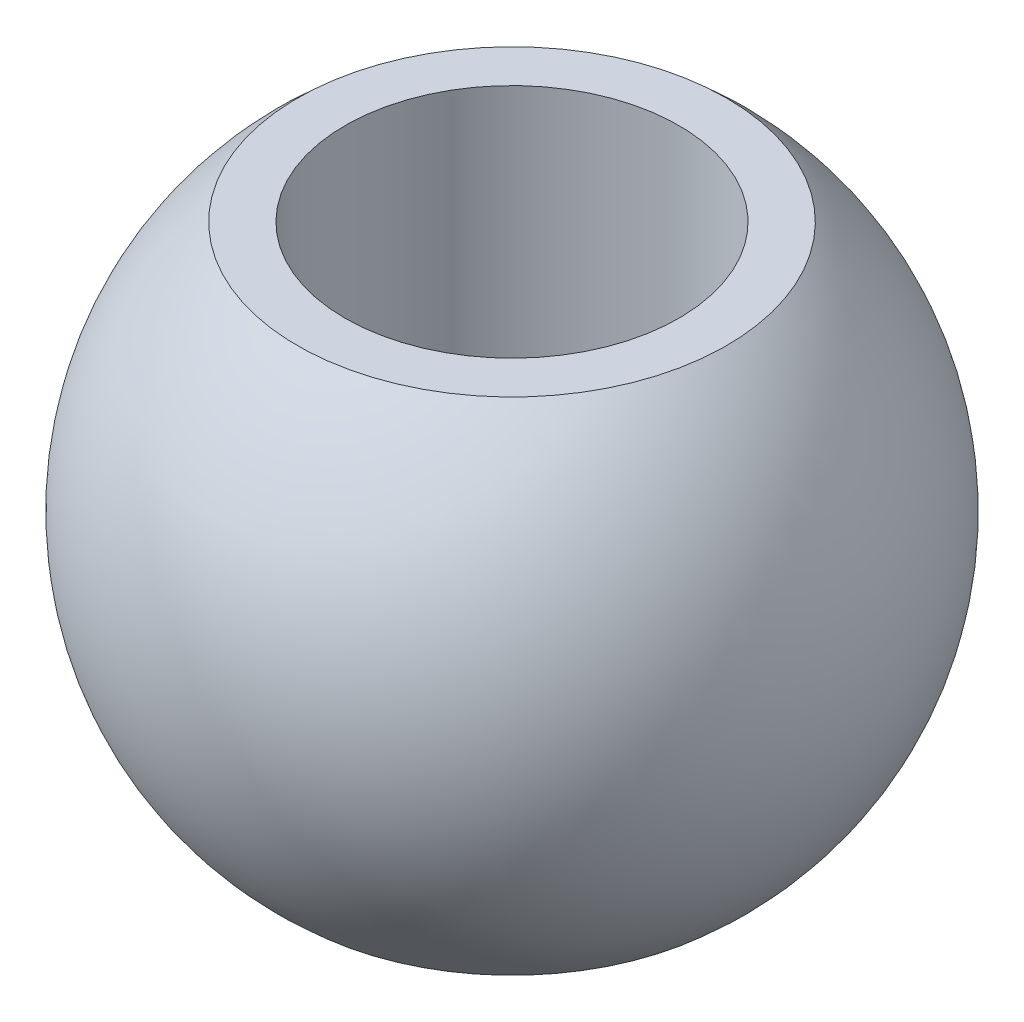
ISO-10303-21;
HEADER;
FILE_DESCRIPTION(('STEP AP214'),'2;1');
FILE_NAME('part.step','',(''),(''),'','','');
FILE_SCHEMA(('AUTOMOTIVE_DESIGN { 1 0 10303 214 1 1 1 1 }'));
ENDSEC;
DATA;
#1=APPLICATION_CONTEXT('core data for automotive mechanical design processes');
#2=APPLICATION_PROTOCOL_DEFINITION('international standard','automotive_design',2000,#1);
#3=PRODUCT_CONTEXT('',#1,'mechanical');
#4=PRODUCT('Part','Part','',(#3));
#5=PRODUCT_RELATED_PRODUCT_CATEGORY('part','',(#4));
#6=PRODUCT_DEFINITION_FORMATION('','',#4);
#7=PRODUCT_DEFINITION_CONTEXT('part definition',#1,'design');
#8=PRODUCT_DEFINITION('design','',#6,#7);
#9=PRODUCT_DEFINITION_SHAPE('','',#8);
#10=(LENGTH_UNIT() NAMED_UNIT(*) SI_UNIT(.MILLI.,.METRE.));
#11=(NAMED_UNIT(*) PLANE_ANGLE_UNIT() SI_UNIT($,.RADIAN.));
#12=(NAMED_UNIT(*) SI_UNIT($,.STERADIAN.) SOLID_ANGLE_UNIT());
#13=UNCERTAINTY_MEASURE_WITH_UNIT(LENGTH_MEASURE(1.E-05),#10,'distance_accuracy_value','');
#14=(GEOMETRIC_REPRESENTATION_CONTEXT(3) GLOBAL_UNCERTAINTY_ASSIGNED_CONTEXT((#13)) GLOBAL_UNIT_ASSIGNED_CONTEXT((#10,
#11,#12)) REPRESENTATION_CONTEXT('',''));
#15=CARTESIAN_POINT('',(0.,0.,0.));
#16=DIRECTION('',(0.,0.,1.));
#17=DIRECTION('',(1.,0.,0.));
#18=AXIS2_PLACEMENT_3D('',#15,#16,#17);
#19=CARTESIAN_POINT('',(0.,0.,0.));
#20=DIRECTION('',(-1.,0.,0.));
#21=DIRECTION('',(0.,1.,0.));
#22=AXIS2_PLACEMENT_3D('',#19,#20,#21);
#23=SPHERICAL_SURFACE('',#22,7.9);
#24=CARTESIAN_POINT('',(0.,0.,0.));
#25=DIRECTION('',(0.,-1.,0.));
#26=DIRECTION('',(0.,0.,-1.));
#27=AXIS2_PLACEMENT_3D('',#24,#25,#26);
#28=SPHERICAL_SURFACE('',#27,7.9);
#29=CARTESIAN_POINT('',(0.,6.,0.));
#30=DIRECTION('',(0.,-1.,0.));
#31=DIRECTION('',(0.,0.,-1.));
#32=AXIS2_PLACEMENT_3D('',#29,#30,#31);
#33=CIRCLE('',#32,5.13906606301184);
#34=CARTESIAN_POINT('',(0.,6.,-5.13906606301184));
#35=VERTEX_POINT('',#34);
#36=EDGE_CURVE('E10',#35,#35,#33,.T.);
#37=ORIENTED_EDGE('',*,*,#36,.T.);
#38=EDGE_LOOP('',(#37));
#39=FACE_BOUND('',#38,.T.);
#40=CARTESIAN_POINT('',(0.,-6.,0.));
#41=DIRECTION('',(0.,-1.,0.));
#42=DIRECTION('',(0.,0.,-1.));
#43=AXIS2_PLACEMENT_3D('',#40,#41,#42);
#44=CIRCLE('',#43,5.13906606301184);
#45=CARTESIAN_POINT('',(0.,-6.,-5.13906606301184));
#46=VERTEX_POINT('',#45);
#47=EDGE_CURVE('E37',#46,#46,#44,.T.);
#48=ORIENTED_EDGE('',*,*,#47,.F.);
#49=EDGE_LOOP('',(#48));
#50=FACE_BOUND('',#49,.T.);
#51=ADVANCED_FACE('F31',(#39,#50),#28,.T.);
#52=CARTESIAN_POINT('',(0.,-6.,-6.));
#53=DIRECTION('',(0.,-1.,0.));
#54=DIRECTION('',(0.,0.,-1.));
#55=AXIS2_PLACEMENT_3D('',#52,#53,#54);
#56=PLANE('',#55);
#57=CARTESIAN_POINT('',(0.,-6.,0.));
#58=DIRECTION('',(0.,1.,0.));
#59=DIRECTION('',(0.,0.,1.));
#60=AXIS2_PLACEMENT_3D('',#57,#58,#59);
#61=CIRCLE('',#60,4.);
#62=CARTESIAN_POINT('',(0.,-6.,4.));
#63=VERTEX_POINT('',#62);
#64=EDGE_CURVE('E41',#63,#63,#61,.T.);
#65=ORIENTED_EDGE('',*,*,#64,.T.);
#66=EDGE_LOOP('',(#65));
#67=FACE_BOUND('',#66,.T.);
#68=ORIENTED_EDGE('',*,*,#47,.T.);
#69=EDGE_LOOP('',(#68));
#70=FACE_BOUND('',#69,.T.);
#71=ADVANCED_FACE('F56',(#67,#70),#56,.T.);
#72=CARTESIAN_POINT('',(0.,6.,-6.));
#73=DIRECTION('',(0.,-1.,0.));
#74=DIRECTION('',(0.,0.,-1.));
#75=AXIS2_PLACEMENT_3D('',#72,#73,#74);
#76=PLANE('',#75);
#77=CARTESIAN_POINT('',(0.,6.,0.));
#78=DIRECTION('',(0.,1.,0.));
#79=DIRECTION('',(0.,0.,1.));
#80=AXIS2_PLACEMENT_3D('',#77,#78,#79);
#81=CIRCLE('',#80,4.);
#82=CARTESIAN_POINT('',(0.,6.,4.));
#83=VERTEX_POINT('',#82);
#84=EDGE_CURVE('E45',#83,#83,#81,.T.);
#85=ORIENTED_EDGE('',*,*,#84,.F.);
#86=EDGE_LOOP('',(#85));
#87=FACE_BOUND('',#86,.T.);
#88=ORIENTED_EDGE('',*,*,#36,.F.);
#89=EDGE_LOOP('',(#88));
#90=FACE_BOUND('',#89,.T.);
#91=ADVANCED_FACE('F53',(#87,#90),#76,.F.);
#92=CARTESIAN_POINT('',(0.,-6.,0.));
#93=DIRECTION('',(0.,1.,0.));
#94=DIRECTION('',(0.,0.,1.));
#95=AXIS2_PLACEMENT_3D('',#92,#93,#94);
#96=CYLINDRICAL_SURFACE('',#95,4.);
#97=ORIENTED_EDGE('',*,*,#64,.F.);
#98=EDGE_LOOP('',(#97));
#99=FACE_BOUND('',#98,.T.);
#100=ORIENTED_EDGE('',*,*,#84,.T.);
#101=EDGE_LOOP('',(#100));
#102=FACE_BOUND('',#101,.T.);
#103=ADVANCED_FACE('F51',(#99,#102),#96,.F.);
#104=CLOSED_SHELL('',(#51,#71,#91,#103));
#105=MANIFOLD_SOLID_BREP('B2',#104);
#106=ADVANCED_BREP_SHAPE_REPRESENTATION('',(#18,#105),#14);
#107=SHAPE_DEFINITION_REPRESENTATION(#9,#106);
ENDSEC;
END-ISO-10303-21;
